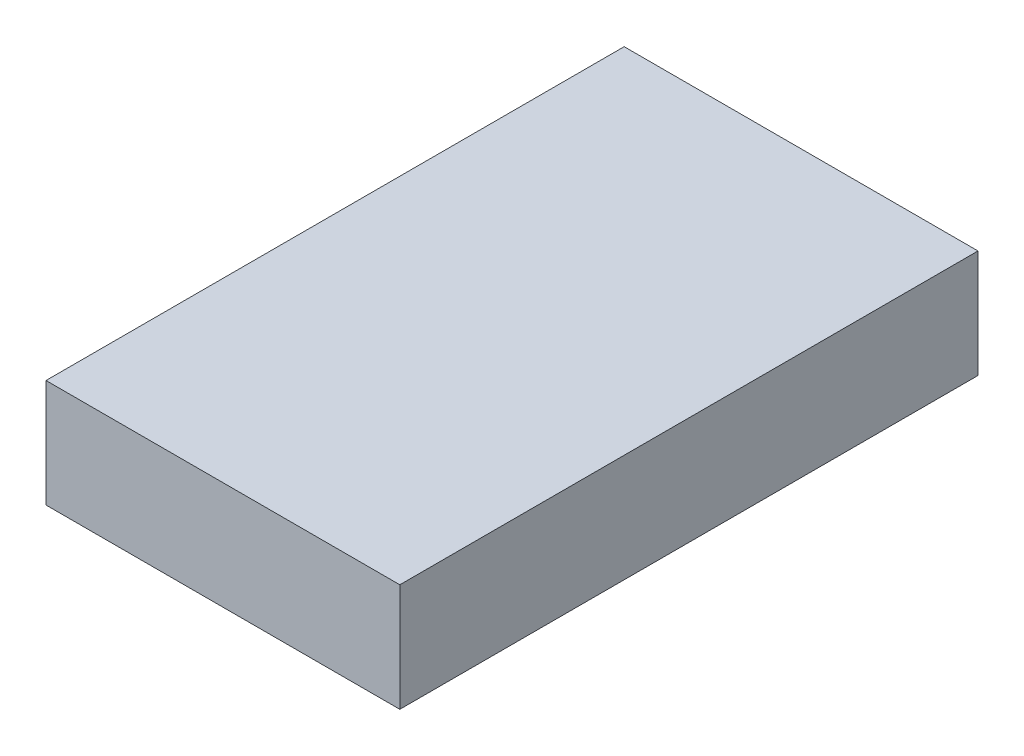
ISO-10303-21;
HEADER;
FILE_DESCRIPTION(('STEP AP214'),'2;1');
FILE_NAME('part.step','',(''),(''),'','','');
FILE_SCHEMA(('AUTOMOTIVE_DESIGN { 1 0 10303 214 1 1 1 1 }'));
ENDSEC;
DATA;
#1=APPLICATION_CONTEXT('core data for automotive mechanical design processes');
#2=APPLICATION_PROTOCOL_DEFINITION('international standard','automotive_design',2000,#1);
#3=PRODUCT_CONTEXT('',#1,'mechanical');
#4=PRODUCT('Part','Part','',(#3));
#5=PRODUCT_RELATED_PRODUCT_CATEGORY('part','',(#4));
#6=PRODUCT_DEFINITION_FORMATION('','',#4);
#7=PRODUCT_DEFINITION_CONTEXT('part definition',#1,'design');
#8=PRODUCT_DEFINITION('design','',#6,#7);
#9=PRODUCT_DEFINITION_SHAPE('','',#8);
#10=(LENGTH_UNIT() NAMED_UNIT(*) SI_UNIT(.MILLI.,.METRE.));
#11=(NAMED_UNIT(*) PLANE_ANGLE_UNIT() SI_UNIT($,.RADIAN.));
#12=(NAMED_UNIT(*) SI_UNIT($,.STERADIAN.) SOLID_ANGLE_UNIT());
#13=UNCERTAINTY_MEASURE_WITH_UNIT(LENGTH_MEASURE(1.E-05),#10,'distance_accuracy_value','');
#14=(GEOMETRIC_REPRESENTATION_CONTEXT(3) GLOBAL_UNCERTAINTY_ASSIGNED_CONTEXT((#13)) GLOBAL_UNIT_ASSIGNED_CONTEXT((#10,
#11,#12)) REPRESENTATION_CONTEXT('',''));
#15=CARTESIAN_POINT('',(0.,0.,0.));
#16=DIRECTION('',(0.,0.,1.));
#17=DIRECTION('',(1.,0.,0.));
#18=AXIS2_PLACEMENT_3D('',#15,#16,#17);
#19=CARTESIAN_POINT('',(41.,25.,-67.));
#20=DIRECTION('',(-1.,0.,0.));
#21=DIRECTION('',(0.,0.,1.));
#22=AXIS2_PLACEMENT_3D('',#19,#20,#21);
#23=PLANE('',#22);
#24=DIRECTION('',(0.,0.,-1.));
#25=VECTOR('',#24,1.);
#26=CARTESIAN_POINT('',(41.,0.,-67.));
#27=LINE('',#26,#25);
#28=CARTESIAN_POINT('',(41.,0.,67.));
#29=VERTEX_POINT('',#28);
#30=CARTESIAN_POINT('',(41.,0.,-67.));
#31=VERTEX_POINT('',#30);
#32=EDGE_CURVE('E97',#29,#31,#27,.T.);
#33=ORIENTED_EDGE('',*,*,#32,.T.);
#34=DIRECTION('',(0.,-1.,0.));
#35=VECTOR('',#34,1.);
#36=CARTESIAN_POINT('',(41.,25.,-67.));
#37=LINE('',#36,#35);
#38=CARTESIAN_POINT('',(41.,25.,-67.));
#39=VERTEX_POINT('',#38);
#40=EDGE_CURVE('E11',#39,#31,#37,.T.);
#41=ORIENTED_EDGE('',*,*,#40,.F.);
#42=DIRECTION('',(0.,0.,-1.));
#43=VECTOR('',#42,1.);
#44=CARTESIAN_POINT('',(41.,25.,-67.));
#45=LINE('',#44,#43);
#46=CARTESIAN_POINT('',(41.,25.,67.));
#47=VERTEX_POINT('',#46);
#48=EDGE_CURVE('E85',#47,#39,#45,.T.);
#49=ORIENTED_EDGE('',*,*,#48,.F.);
#50=DIRECTION('',(0.,-1.,0.));
#51=VECTOR('',#50,1.);
#52=CARTESIAN_POINT('',(41.,25.,67.));
#53=LINE('',#52,#51);
#54=EDGE_CURVE('E93',#47,#29,#53,.T.);
#55=ORIENTED_EDGE('',*,*,#54,.T.);
#56=EDGE_LOOP('',(#33,#41,#49,#55));
#57=FACE_BOUND('',#56,.T.);
#58=ADVANCED_FACE('F34',(#57),#23,.F.);
#59=CARTESIAN_POINT('',(-41.,25.,-67.));
#60=DIRECTION('',(0.,0.,1.));
#61=DIRECTION('',(1.,0.,0.));
#62=AXIS2_PLACEMENT_3D('',#59,#60,#61);
#63=PLANE('',#62);
#64=DIRECTION('',(-1.,0.,0.));
#65=VECTOR('',#64,1.);
#66=CARTESIAN_POINT('',(-41.,0.,-67.));
#67=LINE('',#66,#65);
#68=CARTESIAN_POINT('',(-41.,0.,-67.));
#69=VERTEX_POINT('',#68);
#70=EDGE_CURVE('E89',#31,#69,#67,.T.);
#71=ORIENTED_EDGE('',*,*,#70,.T.);
#72=DIRECTION('',(0.,-1.,0.));
#73=VECTOR('',#72,1.);
#74=CARTESIAN_POINT('',(-41.,25.,-67.));
#75=LINE('',#74,#73);
#76=CARTESIAN_POINT('',(-41.,25.,-67.));
#77=VERTEX_POINT('',#76);
#78=EDGE_CURVE('E42',#77,#69,#75,.T.);
#79=ORIENTED_EDGE('',*,*,#78,.F.);
#80=DIRECTION('',(-1.,0.,0.));
#81=VECTOR('',#80,1.);
#82=CARTESIAN_POINT('',(-41.,25.,-67.));
#83=LINE('',#82,#81);
#84=EDGE_CURVE('E80',#39,#77,#83,.T.);
#85=ORIENTED_EDGE('',*,*,#84,.F.);
#86=ORIENTED_EDGE('',*,*,#40,.T.);
#87=EDGE_LOOP('',(#71,#79,#85,#86));
#88=FACE_BOUND('',#87,.T.);
#89=ADVANCED_FACE('F88',(#88),#63,.F.);
#90=CARTESIAN_POINT('',(-41.,25.,-67.));
#91=DIRECTION('',(1.,0.,0.));
#92=DIRECTION('',(0.,0.,-1.));
#93=AXIS2_PLACEMENT_3D('',#90,#91,#92);
#94=PLANE('',#93);
#95=DIRECTION('',(0.,0.,1.));
#96=VECTOR('',#95,1.);
#97=CARTESIAN_POINT('',(-41.,0.,-67.));
#98=LINE('',#97,#96);
#99=CARTESIAN_POINT('',(-41.,0.,67.));
#100=VERTEX_POINT('',#99);
#101=EDGE_CURVE('E67',#69,#100,#98,.T.);
#102=ORIENTED_EDGE('',*,*,#101,.T.);
#103=DIRECTION('',(0.,-1.,0.));
#104=VECTOR('',#103,1.);
#105=CARTESIAN_POINT('',(-41.,25.,67.));
#106=LINE('',#105,#104);
#107=CARTESIAN_POINT('',(-41.,25.,67.));
#108=VERTEX_POINT('',#107);
#109=EDGE_CURVE('E90',#108,#100,#106,.T.);
#110=ORIENTED_EDGE('',*,*,#109,.F.);
#111=DIRECTION('',(0.,0.,1.));
#112=VECTOR('',#111,1.);
#113=CARTESIAN_POINT('',(-41.,25.,-67.));
#114=LINE('',#113,#112);
#115=EDGE_CURVE('E83',#77,#108,#114,.T.);
#116=ORIENTED_EDGE('',*,*,#115,.F.);
#117=ORIENTED_EDGE('',*,*,#78,.T.);
#118=EDGE_LOOP('',(#102,#110,#116,#117));
#119=FACE_BOUND('',#118,.T.);
#120=ADVANCED_FACE('F91',(#119),#94,.F.);
#121=CARTESIAN_POINT('',(-41.,25.,67.));
#122=DIRECTION('',(0.,0.,-1.));
#123=DIRECTION('',(-1.,0.,0.));
#124=AXIS2_PLACEMENT_3D('',#121,#122,#123);
#125=PLANE('',#124);
#126=DIRECTION('',(1.,0.,0.));
#127=VECTOR('',#126,1.);
#128=CARTESIAN_POINT('',(-41.,0.,67.));
#129=LINE('',#128,#127);
#130=EDGE_CURVE('E73',#100,#29,#129,.T.);
#131=ORIENTED_EDGE('',*,*,#130,.T.);
#132=ORIENTED_EDGE('',*,*,#54,.F.);
#133=DIRECTION('',(1.,0.,0.));
#134=VECTOR('',#133,1.);
#135=CARTESIAN_POINT('',(-41.,25.,67.));
#136=LINE('',#135,#134);
#137=EDGE_CURVE('E50',#108,#47,#136,.T.);
#138=ORIENTED_EDGE('',*,*,#137,.F.);
#139=ORIENTED_EDGE('',*,*,#109,.T.);
#140=EDGE_LOOP('',(#131,#132,#138,#139));
#141=FACE_BOUND('',#140,.T.);
#142=ADVANCED_FACE('F104',(#141),#125,.F.);
#143=CARTESIAN_POINT('',(0.,25.,0.));
#144=DIRECTION('',(0.,1.,0.));
#145=DIRECTION('',(0.,0.,1.));
#146=AXIS2_PLACEMENT_3D('',#143,#144,#145);
#147=PLANE('',#146);
#148=ORIENTED_EDGE('',*,*,#48,.T.);
#149=ORIENTED_EDGE('',*,*,#84,.T.);
#150=ORIENTED_EDGE('',*,*,#115,.T.);
#151=ORIENTED_EDGE('',*,*,#137,.T.);
#152=EDGE_LOOP('',(#148,#149,#150,#151));
#153=FACE_BOUND('',#152,.T.);
#154=ADVANCED_FACE('F81',(#153),#147,.T.);
#155=CARTESIAN_POINT('',(0.,0.,0.));
#156=DIRECTION('',(0.,1.,0.));
#157=DIRECTION('',(0.,0.,1.));
#158=AXIS2_PLACEMENT_3D('',#155,#156,#157);
#159=PLANE('',#158);
#160=ORIENTED_EDGE('',*,*,#32,.F.);
#161=ORIENTED_EDGE('',*,*,#130,.F.);
#162=ORIENTED_EDGE('',*,*,#101,.F.);
#163=ORIENTED_EDGE('',*,*,#70,.F.);
#164=EDGE_LOOP('',(#160,#161,#162,#163));
#165=FACE_BOUND('',#164,.T.);
#166=ADVANCED_FACE('F107',(#165),#159,.F.);
#167=CLOSED_SHELL('',(#58,#89,#120,#142,#154,#166));
#168=MANIFOLD_SOLID_BREP('B2',#167);
#169=ADVANCED_BREP_SHAPE_REPRESENTATION('',(#18,#168),#14);
#170=SHAPE_DEFINITION_REPRESENTATION(#9,#169);
ENDSEC;
END-ISO-10303-21;
